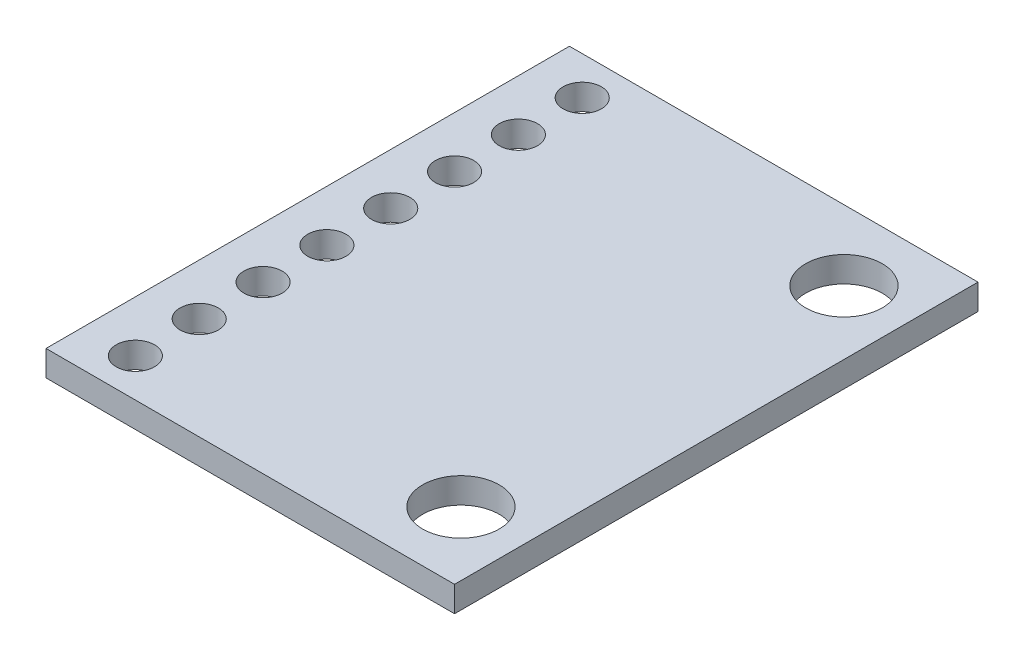
ISO-10303-21;
HEADER;
FILE_DESCRIPTION(('STEP AP214'),'2;1');
FILE_NAME('part.step','',(''),(''),'','','');
FILE_SCHEMA(('AUTOMOTIVE_DESIGN { 1 0 10303 214 1 1 1 1 }'));
ENDSEC;
DATA;
#1=APPLICATION_CONTEXT('core data for automotive mechanical design processes');
#2=APPLICATION_PROTOCOL_DEFINITION('international standard','automotive_design',2000,#1);
#3=PRODUCT_CONTEXT('',#1,'mechanical');
#4=PRODUCT('Part','Part','',(#3));
#5=PRODUCT_RELATED_PRODUCT_CATEGORY('part','',(#4));
#6=PRODUCT_DEFINITION_FORMATION('','',#4);
#7=PRODUCT_DEFINITION_CONTEXT('part definition',#1,'design');
#8=PRODUCT_DEFINITION('design','',#6,#7);
#9=PRODUCT_DEFINITION_SHAPE('','',#8);
#10=(LENGTH_UNIT() NAMED_UNIT(*) SI_UNIT(.MILLI.,.METRE.));
#11=(NAMED_UNIT(*) PLANE_ANGLE_UNIT() SI_UNIT($,.RADIAN.));
#12=(NAMED_UNIT(*) SI_UNIT($,.STERADIAN.) SOLID_ANGLE_UNIT());
#13=UNCERTAINTY_MEASURE_WITH_UNIT(LENGTH_MEASURE(1.E-05),#10,'distance_accuracy_value','');
#14=(GEOMETRIC_REPRESENTATION_CONTEXT(3) GLOBAL_UNCERTAINTY_ASSIGNED_CONTEXT((#13)) GLOBAL_UNIT_ASSIGNED_CONTEXT((#10,
#11,#12)) REPRESENTATION_CONTEXT('',''));
#15=CARTESIAN_POINT('',(0.,0.,0.));
#16=DIRECTION('',(0.,0.,1.));
#17=DIRECTION('',(1.,0.,0.));
#18=AXIS2_PLACEMENT_3D('',#15,#16,#17);
#19=CARTESIAN_POINT('',(0.,1.,0.));
#20=DIRECTION('',(0.,-1.,0.));
#21=DIRECTION('',(0.,0.,-1.));
#22=AXIS2_PLACEMENT_3D('',#19,#20,#21);
#23=PLANE('',#22);
#24=CARTESIAN_POINT('',(-5.99999999999998,1.,-8.74999999999985));
#25=DIRECTION('',(0.,1.,0.));
#26=DIRECTION('',(0.,0.,1.));
#27=AXIS2_PLACEMENT_3D('',#24,#25,#26);
#28=CIRCLE('',#27,0.75);
#29=CARTESIAN_POINT('',(-5.99999999999998,1.,-7.99999999999985));
#30=VERTEX_POINT('',#29);
#31=EDGE_CURVE('E166',#30,#30,#28,.T.);
#32=ORIENTED_EDGE('',*,*,#31,.F.);
#33=EDGE_LOOP('',(#32));
#34=FACE_BOUND('',#33,.T.);
#35=CARTESIAN_POINT('',(-5.99999999999996,1.,-6.24999999999985));
#36=DIRECTION('',(0.,1.,0.));
#37=DIRECTION('',(0.,0.,1.));
#38=AXIS2_PLACEMENT_3D('',#35,#36,#37);
#39=CIRCLE('',#38,0.75);
#40=CARTESIAN_POINT('',(-5.99999999999996,1.,-5.49999999999985));
#41=VERTEX_POINT('',#40);
#42=EDGE_CURVE('E160',#41,#41,#39,.T.);
#43=ORIENTED_EDGE('',*,*,#42,.F.);
#44=EDGE_LOOP('',(#43));
#45=FACE_BOUND('',#44,.T.);
#46=CARTESIAN_POINT('',(-5.99999999999993,1.,-3.74999999999984));
#47=DIRECTION('',(0.,1.,0.));
#48=DIRECTION('',(0.,0.,1.));
#49=AXIS2_PLACEMENT_3D('',#46,#47,#48);
#50=CIRCLE('',#49,0.75);
#51=CARTESIAN_POINT('',(-5.99999999999993,1.,-2.99999999999984));
#52=VERTEX_POINT('',#51);
#53=EDGE_CURVE('E154',#52,#52,#50,.T.);
#54=ORIENTED_EDGE('',*,*,#53,.F.);
#55=EDGE_LOOP('',(#54));
#56=FACE_BOUND('',#55,.T.);
#57=CARTESIAN_POINT('',(-5.9999999999999,1.,-1.24999999999983));
#58=DIRECTION('',(0.,1.,0.));
#59=DIRECTION('',(0.,0.,1.));
#60=AXIS2_PLACEMENT_3D('',#57,#58,#59);
#61=CIRCLE('',#60,0.750000000000001);
#62=CARTESIAN_POINT('',(-5.9999999999999,1.,-0.499999999999833));
#63=VERTEX_POINT('',#62);
#64=EDGE_CURVE('E148',#63,#63,#61,.T.);
#65=ORIENTED_EDGE('',*,*,#64,.F.);
#66=EDGE_LOOP('',(#65));
#67=FACE_BOUND('',#66,.T.);
#68=CARTESIAN_POINT('',(-5.99999999999988,1.,1.25000000000017));
#69=DIRECTION('',(0.,1.,0.));
#70=DIRECTION('',(0.,0.,1.));
#71=AXIS2_PLACEMENT_3D('',#68,#69,#70);
#72=CIRCLE('',#71,0.750000000000001);
#73=CARTESIAN_POINT('',(-5.99999999999988,1.,2.00000000000017));
#74=VERTEX_POINT('',#73);
#75=EDGE_CURVE('E142',#74,#74,#72,.T.);
#76=ORIENTED_EDGE('',*,*,#75,.F.);
#77=EDGE_LOOP('',(#76));
#78=FACE_BOUND('',#77,.T.);
#79=CARTESIAN_POINT('',(-5.99999999999985,1.,3.75000000000018));
#80=DIRECTION('',(0.,1.,0.));
#81=DIRECTION('',(0.,0.,1.));
#82=AXIS2_PLACEMENT_3D('',#79,#80,#81);
#83=CIRCLE('',#82,0.750000000000001);
#84=CARTESIAN_POINT('',(-5.99999999999985,1.,4.50000000000018));
#85=VERTEX_POINT('',#84);
#86=EDGE_CURVE('E136',#85,#85,#83,.T.);
#87=ORIENTED_EDGE('',*,*,#86,.F.);
#88=EDGE_LOOP('',(#87));
#89=FACE_BOUND('',#88,.T.);
#90=CARTESIAN_POINT('',(-5.99999999999983,1.,6.25000000000018));
#91=DIRECTION('',(0.,1.,0.));
#92=DIRECTION('',(0.,0.,1.));
#93=AXIS2_PLACEMENT_3D('',#90,#91,#92);
#94=CIRCLE('',#93,0.750000000000001);
#95=CARTESIAN_POINT('',(-5.99999999999983,1.,7.00000000000019));
#96=VERTEX_POINT('',#95);
#97=EDGE_CURVE('E130',#96,#96,#94,.T.);
#98=ORIENTED_EDGE('',*,*,#97,.F.);
#99=EDGE_LOOP('',(#98));
#100=FACE_BOUND('',#99,.T.);
#101=CARTESIAN_POINT('',(-5.9999999999998,1.,8.75000000000019));
#102=DIRECTION('',(0.,1.,0.));
#103=DIRECTION('',(0.,0.,1.));
#104=AXIS2_PLACEMENT_3D('',#101,#102,#103);
#105=CIRCLE('',#104,0.750000000000001);
#106=CARTESIAN_POINT('',(-5.9999999999998,1.,9.50000000000019));
#107=VERTEX_POINT('',#106);
#108=EDGE_CURVE('E124',#107,#107,#105,.T.);
#109=ORIENTED_EDGE('',*,*,#108,.F.);
#110=EDGE_LOOP('',(#109));
#111=FACE_BOUND('',#110,.T.);
#112=DIRECTION('',(0.,0.,-1.));
#113=VECTOR('',#112,1.);
#114=CARTESIAN_POINT('',(8.,1.,10.25));
#115=LINE('',#114,#113);
#116=CARTESIAN_POINT('',(8.,1.,10.25));
#117=VERTEX_POINT('',#116);
#118=CARTESIAN_POINT('',(8.,1.,-10.25));
#119=VERTEX_POINT('',#118);
#120=EDGE_CURVE('E85',#117,#119,#115,.T.);
#121=ORIENTED_EDGE('',*,*,#120,.T.);
#122=DIRECTION('',(-1.,0.,0.));
#123=VECTOR('',#122,1.);
#124=CARTESIAN_POINT('',(-8.,1.,-10.25));
#125=LINE('',#124,#123);
#126=CARTESIAN_POINT('',(-8.,1.,-10.25));
#127=VERTEX_POINT('',#126);
#128=EDGE_CURVE('E80',#119,#127,#125,.T.);
#129=ORIENTED_EDGE('',*,*,#128,.T.);
#130=DIRECTION('',(0.,0.,1.));
#131=VECTOR('',#130,1.);
#132=CARTESIAN_POINT('',(-8.,1.,10.25));
#133=LINE('',#132,#131);
#134=CARTESIAN_POINT('',(-8.,1.,10.25));
#135=VERTEX_POINT('',#134);
#136=EDGE_CURVE('E83',#127,#135,#133,.T.);
#137=ORIENTED_EDGE('',*,*,#136,.T.);
#138=DIRECTION('',(1.,0.,0.));
#139=VECTOR('',#138,1.);
#140=CARTESIAN_POINT('',(-8.,1.,10.25));
#141=LINE('',#140,#139);
#142=EDGE_CURVE('E50',#135,#117,#141,.T.);
#143=ORIENTED_EDGE('',*,*,#142,.T.);
#144=EDGE_LOOP('',(#121,#129,#137,#143));
#145=FACE_BOUND('',#144,.T.);
#146=CARTESIAN_POINT('',(5.5,1.,-7.5));
#147=DIRECTION('',(0.,1.,0.));
#148=DIRECTION('',(0.,0.,1.));
#149=AXIS2_PLACEMENT_3D('',#146,#147,#148);
#150=CIRCLE('',#149,1.5);
#151=CARTESIAN_POINT('',(5.5,1.,-6.));
#152=VERTEX_POINT('',#151);
#153=EDGE_CURVE('E100',#152,#152,#150,.T.);
#154=ORIENTED_EDGE('',*,*,#153,.F.);
#155=EDGE_LOOP('',(#154));
#156=FACE_BOUND('',#155,.T.);
#157=CARTESIAN_POINT('',(5.5,1.,7.5));
#158=DIRECTION('',(0.,1.,0.));
#159=DIRECTION('',(0.,0.,1.));
#160=AXIS2_PLACEMENT_3D('',#157,#158,#159);
#161=CIRCLE('',#160,1.5);
#162=CARTESIAN_POINT('',(5.5,1.,9.));
#163=VERTEX_POINT('',#162);
#164=EDGE_CURVE('E115',#163,#163,#161,.T.);
#165=ORIENTED_EDGE('',*,*,#164,.F.);
#166=EDGE_LOOP('',(#165));
#167=FACE_BOUND('',#166,.T.);
#168=ADVANCED_FACE('F33',(#34,#45,#56,#67,#78,#89,#100,#111,#145,#156,#167),#23,.F.);
#169=CARTESIAN_POINT('',(0.,0.,0.));
#170=DIRECTION('',(0.,-1.,0.));
#171=DIRECTION('',(0.,0.,-1.));
#172=AXIS2_PLACEMENT_3D('',#169,#170,#171);
#173=PLANE('',#172);
#174=CARTESIAN_POINT('',(-5.99999999999998,0.,-8.74999999999985));
#175=DIRECTION('',(0.,1.,0.));
#176=DIRECTION('',(0.,0.,1.));
#177=AXIS2_PLACEMENT_3D('',#174,#175,#176);
#178=CIRCLE('',#177,0.75);
#179=CARTESIAN_POINT('',(-5.99999999999998,0.,-7.99999999999985));
#180=VERTEX_POINT('',#179);
#181=EDGE_CURVE('E121',#180,#180,#178,.T.);
#182=ORIENTED_EDGE('',*,*,#181,.T.);
#183=EDGE_LOOP('',(#182));
#184=FACE_BOUND('',#183,.T.);
#185=CARTESIAN_POINT('',(-5.99999999999996,0.,-6.24999999999985));
#186=DIRECTION('',(0.,1.,0.));
#187=DIRECTION('',(0.,0.,1.));
#188=AXIS2_PLACEMENT_3D('',#185,#186,#187);
#189=CIRCLE('',#188,0.75);
#190=CARTESIAN_POINT('',(-5.99999999999996,0.,-5.49999999999985));
#191=VERTEX_POINT('',#190);
#192=EDGE_CURVE('E163',#191,#191,#189,.T.);
#193=ORIENTED_EDGE('',*,*,#192,.T.);
#194=EDGE_LOOP('',(#193));
#195=FACE_BOUND('',#194,.T.);
#196=CARTESIAN_POINT('',(-5.99999999999993,0.,-3.74999999999984));
#197=DIRECTION('',(0.,1.,0.));
#198=DIRECTION('',(0.,0.,1.));
#199=AXIS2_PLACEMENT_3D('',#196,#197,#198);
#200=CIRCLE('',#199,0.75);
#201=CARTESIAN_POINT('',(-5.99999999999993,0.,-2.99999999999984));
#202=VERTEX_POINT('',#201);
#203=EDGE_CURVE('E157',#202,#202,#200,.T.);
#204=ORIENTED_EDGE('',*,*,#203,.T.);
#205=EDGE_LOOP('',(#204));
#206=FACE_BOUND('',#205,.T.);
#207=CARTESIAN_POINT('',(-5.9999999999999,0.,-1.24999999999983));
#208=DIRECTION('',(0.,1.,0.));
#209=DIRECTION('',(0.,0.,1.));
#210=AXIS2_PLACEMENT_3D('',#207,#208,#209);
#211=CIRCLE('',#210,0.750000000000001);
#212=CARTESIAN_POINT('',(-5.9999999999999,0.,-0.499999999999833));
#213=VERTEX_POINT('',#212);
#214=EDGE_CURVE('E151',#213,#213,#211,.T.);
#215=ORIENTED_EDGE('',*,*,#214,.T.);
#216=EDGE_LOOP('',(#215));
#217=FACE_BOUND('',#216,.T.);
#218=CARTESIAN_POINT('',(-5.99999999999988,0.,1.25000000000017));
#219=DIRECTION('',(0.,1.,0.));
#220=DIRECTION('',(0.,0.,1.));
#221=AXIS2_PLACEMENT_3D('',#218,#219,#220);
#222=CIRCLE('',#221,0.750000000000001);
#223=CARTESIAN_POINT('',(-5.99999999999988,0.,2.00000000000017));
#224=VERTEX_POINT('',#223);
#225=EDGE_CURVE('E145',#224,#224,#222,.T.);
#226=ORIENTED_EDGE('',*,*,#225,.T.);
#227=EDGE_LOOP('',(#226));
#228=FACE_BOUND('',#227,.T.);
#229=CARTESIAN_POINT('',(-5.99999999999985,0.,3.75000000000018));
#230=DIRECTION('',(0.,1.,0.));
#231=DIRECTION('',(0.,0.,1.));
#232=AXIS2_PLACEMENT_3D('',#229,#230,#231);
#233=CIRCLE('',#232,0.750000000000001);
#234=CARTESIAN_POINT('',(-5.99999999999985,0.,4.50000000000018));
#235=VERTEX_POINT('',#234);
#236=EDGE_CURVE('E139',#235,#235,#233,.T.);
#237=ORIENTED_EDGE('',*,*,#236,.T.);
#238=EDGE_LOOP('',(#237));
#239=FACE_BOUND('',#238,.T.);
#240=CARTESIAN_POINT('',(-5.99999999999983,0.,6.25000000000018));
#241=DIRECTION('',(0.,1.,0.));
#242=DIRECTION('',(0.,0.,1.));
#243=AXIS2_PLACEMENT_3D('',#240,#241,#242);
#244=CIRCLE('',#243,0.750000000000001);
#245=CARTESIAN_POINT('',(-5.99999999999983,0.,7.00000000000019));
#246=VERTEX_POINT('',#245);
#247=EDGE_CURVE('E133',#246,#246,#244,.T.);
#248=ORIENTED_EDGE('',*,*,#247,.T.);
#249=EDGE_LOOP('',(#248));
#250=FACE_BOUND('',#249,.T.);
#251=CARTESIAN_POINT('',(-5.9999999999998,0.,8.75000000000019));
#252=DIRECTION('',(0.,1.,0.));
#253=DIRECTION('',(0.,0.,1.));
#254=AXIS2_PLACEMENT_3D('',#251,#252,#253);
#255=CIRCLE('',#254,0.750000000000001);
#256=CARTESIAN_POINT('',(-5.9999999999998,0.,9.50000000000019));
#257=VERTEX_POINT('',#256);
#258=EDGE_CURVE('E127',#257,#257,#255,.T.);
#259=ORIENTED_EDGE('',*,*,#258,.T.);
#260=EDGE_LOOP('',(#259));
#261=FACE_BOUND('',#260,.T.);
#262=CARTESIAN_POINT('',(5.5,0.,-7.5));
#263=DIRECTION('',(0.,1.,0.));
#264=DIRECTION('',(0.,0.,1.));
#265=AXIS2_PLACEMENT_3D('',#262,#263,#264);
#266=CIRCLE('',#265,1.5);
#267=CARTESIAN_POINT('',(5.5,0.,-6.));
#268=VERTEX_POINT('',#267);
#269=EDGE_CURVE('E112',#268,#268,#266,.T.);
#270=ORIENTED_EDGE('',*,*,#269,.T.);
#271=EDGE_LOOP('',(#270));
#272=FACE_BOUND('',#271,.T.);
#273=DIRECTION('',(0.,0.,-1.));
#274=VECTOR('',#273,1.);
#275=CARTESIAN_POINT('',(8.,0.,10.25));
#276=LINE('',#275,#274);
#277=CARTESIAN_POINT('',(8.,0.,10.25));
#278=VERTEX_POINT('',#277);
#279=CARTESIAN_POINT('',(8.,0.,-10.25));
#280=VERTEX_POINT('',#279);
#281=EDGE_CURVE('E97',#278,#280,#276,.T.);
#282=ORIENTED_EDGE('',*,*,#281,.F.);
#283=DIRECTION('',(1.,0.,0.));
#284=VECTOR('',#283,1.);
#285=CARTESIAN_POINT('',(-8.,0.,10.25));
#286=LINE('',#285,#284);
#287=CARTESIAN_POINT('',(-8.,0.,10.25));
#288=VERTEX_POINT('',#287);
#289=EDGE_CURVE('E73',#288,#278,#286,.T.);
#290=ORIENTED_EDGE('',*,*,#289,.F.);
#291=DIRECTION('',(0.,0.,1.));
#292=VECTOR('',#291,1.);
#293=CARTESIAN_POINT('',(-8.,0.,10.25));
#294=LINE('',#293,#292);
#295=CARTESIAN_POINT('',(-8.,0.,-10.25));
#296=VERTEX_POINT('',#295);
#297=EDGE_CURVE('E67',#296,#288,#294,.T.);
#298=ORIENTED_EDGE('',*,*,#297,.F.);
#299=DIRECTION('',(-1.,0.,0.));
#300=VECTOR('',#299,1.);
#301=CARTESIAN_POINT('',(-8.,0.,-10.25));
#302=LINE('',#301,#300);
#303=EDGE_CURVE('E89',#280,#296,#302,.T.);
#304=ORIENTED_EDGE('',*,*,#303,.F.);
#305=EDGE_LOOP('',(#282,#290,#298,#304));
#306=FACE_BOUND('',#305,.T.);
#307=CARTESIAN_POINT('',(5.5,0.,7.5));
#308=DIRECTION('',(0.,1.,0.));
#309=DIRECTION('',(0.,0.,1.));
#310=AXIS2_PLACEMENT_3D('',#307,#308,#309);
#311=CIRCLE('',#310,1.5);
#312=CARTESIAN_POINT('',(5.5,0.,9.));
#313=VERTEX_POINT('',#312);
#314=EDGE_CURVE('E118',#313,#313,#311,.T.);
#315=ORIENTED_EDGE('',*,*,#314,.T.);
#316=EDGE_LOOP('',(#315));
#317=FACE_BOUND('',#316,.T.);
#318=ADVANCED_FACE('F108',(#184,#195,#206,#217,#228,#239,#250,#261,#272,#306,#317),#173,.T.);
#319=CARTESIAN_POINT('',(8.,1.,10.25));
#320=DIRECTION('',(-1.,0.,0.));
#321=DIRECTION('',(0.,0.,1.));
#322=AXIS2_PLACEMENT_3D('',#319,#320,#321);
#323=PLANE('',#322);
#324=ORIENTED_EDGE('',*,*,#281,.T.);
#325=DIRECTION('',(0.,-1.,0.));
#326=VECTOR('',#325,1.);
#327=CARTESIAN_POINT('',(8.,1.,-10.25));
#328=LINE('',#327,#326);
#329=EDGE_CURVE('E11',#119,#280,#328,.T.);
#330=ORIENTED_EDGE('',*,*,#329,.F.);
#331=ORIENTED_EDGE('',*,*,#120,.F.);
#332=DIRECTION('',(0.,-1.,0.));
#333=VECTOR('',#332,1.);
#334=CARTESIAN_POINT('',(8.,1.,10.25));
#335=LINE('',#334,#333);
#336=EDGE_CURVE('E93',#117,#278,#335,.T.);
#337=ORIENTED_EDGE('',*,*,#336,.T.);
#338=EDGE_LOOP('',(#324,#330,#331,#337));
#339=FACE_BOUND('',#338,.T.);
#340=ADVANCED_FACE('F35',(#339),#323,.F.);
#341=CARTESIAN_POINT('',(-8.,1.,-10.25));
#342=DIRECTION('',(0.,0.,1.));
#343=DIRECTION('',(1.,0.,0.));
#344=AXIS2_PLACEMENT_3D('',#341,#342,#343);
#345=PLANE('',#344);
#346=ORIENTED_EDGE('',*,*,#303,.T.);
#347=DIRECTION('',(0.,-1.,0.));
#348=VECTOR('',#347,1.);
#349=CARTESIAN_POINT('',(-8.,1.,-10.25));
#350=LINE('',#349,#348);
#351=EDGE_CURVE('E42',#127,#296,#350,.T.);
#352=ORIENTED_EDGE('',*,*,#351,.F.);
#353=ORIENTED_EDGE('',*,*,#128,.F.);
#354=ORIENTED_EDGE('',*,*,#329,.T.);
#355=EDGE_LOOP('',(#346,#352,#353,#354));
#356=FACE_BOUND('',#355,.T.);
#357=ADVANCED_FACE('F88',(#356),#345,.F.);
#358=CARTESIAN_POINT('',(-8.,1.,10.25));
#359=DIRECTION('',(1.,0.,0.));
#360=DIRECTION('',(0.,0.,-1.));
#361=AXIS2_PLACEMENT_3D('',#358,#359,#360);
#362=PLANE('',#361);
#363=ORIENTED_EDGE('',*,*,#297,.T.);
#364=DIRECTION('',(0.,-1.,0.));
#365=VECTOR('',#364,1.);
#366=CARTESIAN_POINT('',(-8.,1.,10.25));
#367=LINE('',#366,#365);
#368=EDGE_CURVE('E90',#135,#288,#367,.T.);
#369=ORIENTED_EDGE('',*,*,#368,.F.);
#370=ORIENTED_EDGE('',*,*,#136,.F.);
#371=ORIENTED_EDGE('',*,*,#351,.T.);
#372=EDGE_LOOP('',(#363,#369,#370,#371));
#373=FACE_BOUND('',#372,.T.);
#374=ADVANCED_FACE('F91',(#373),#362,.F.);
#375=CARTESIAN_POINT('',(-8.,1.,10.25));
#376=DIRECTION('',(0.,0.,-1.));
#377=DIRECTION('',(-1.,0.,0.));
#378=AXIS2_PLACEMENT_3D('',#375,#376,#377);
#379=PLANE('',#378);
#380=ORIENTED_EDGE('',*,*,#289,.T.);
#381=ORIENTED_EDGE('',*,*,#336,.F.);
#382=ORIENTED_EDGE('',*,*,#142,.F.);
#383=ORIENTED_EDGE('',*,*,#368,.T.);
#384=EDGE_LOOP('',(#380,#381,#382,#383));
#385=FACE_BOUND('',#384,.T.);
#386=ADVANCED_FACE('F105',(#385),#379,.F.);
#387=CARTESIAN_POINT('',(5.5,1.,-7.5));
#388=DIRECTION('',(0.,-1.,0.));
#389=DIRECTION('',(0.,0.,-1.));
#390=AXIS2_PLACEMENT_3D('',#387,#388,#389);
#391=CYLINDRICAL_SURFACE('',#390,1.5);
#392=ORIENTED_EDGE('',*,*,#153,.T.);
#393=EDGE_LOOP('',(#392));
#394=FACE_BOUND('',#393,.T.);
#395=ORIENTED_EDGE('',*,*,#269,.F.);
#396=EDGE_LOOP('',(#395));
#397=FACE_BOUND('',#396,.T.);
#398=ADVANCED_FACE('F211',(#394,#397),#391,.F.);
#399=CARTESIAN_POINT('',(5.5,1.,7.5));
#400=DIRECTION('',(0.,-1.,0.));
#401=DIRECTION('',(0.,0.,-1.));
#402=AXIS2_PLACEMENT_3D('',#399,#400,#401);
#403=CYLINDRICAL_SURFACE('',#402,1.5);
#404=ORIENTED_EDGE('',*,*,#164,.T.);
#405=EDGE_LOOP('',(#404));
#406=FACE_BOUND('',#405,.T.);
#407=ORIENTED_EDGE('',*,*,#314,.F.);
#408=EDGE_LOOP('',(#407));
#409=FACE_BOUND('',#408,.T.);
#410=ADVANCED_FACE('F201',(#406,#409),#403,.F.);
#411=CARTESIAN_POINT('',(-5.9999999999998,0.,8.75000000000019));
#412=DIRECTION('',(0.,1.,0.));
#413=DIRECTION('',(0.,0.,1.));
#414=AXIS2_PLACEMENT_3D('',#411,#412,#413);
#415=CYLINDRICAL_SURFACE('',#414,0.750000000000001);
#416=ORIENTED_EDGE('',*,*,#258,.F.);
#417=EDGE_LOOP('',(#416));
#418=FACE_BOUND('',#417,.T.);
#419=ORIENTED_EDGE('',*,*,#108,.T.);
#420=EDGE_LOOP('',(#419));
#421=FACE_BOUND('',#420,.T.);
#422=ADVANCED_FACE('F198',(#418,#421),#415,.F.);
#423=CARTESIAN_POINT('',(-5.99999999999983,0.,6.25000000000018));
#424=DIRECTION('',(0.,1.,0.));
#425=DIRECTION('',(0.,0.,1.));
#426=AXIS2_PLACEMENT_3D('',#423,#424,#425);
#427=CYLINDRICAL_SURFACE('',#426,0.750000000000001);
#428=ORIENTED_EDGE('',*,*,#247,.F.);
#429=EDGE_LOOP('',(#428));
#430=FACE_BOUND('',#429,.T.);
#431=ORIENTED_EDGE('',*,*,#97,.T.);
#432=EDGE_LOOP('',(#431));
#433=FACE_BOUND('',#432,.T.);
#434=ADVANCED_FACE('F200',(#430,#433),#427,.F.);
#435=CARTESIAN_POINT('',(-5.99999999999985,0.,3.75000000000018));
#436=DIRECTION('',(0.,1.,0.));
#437=DIRECTION('',(0.,0.,1.));
#438=AXIS2_PLACEMENT_3D('',#435,#436,#437);
#439=CYLINDRICAL_SURFACE('',#438,0.750000000000001);
#440=ORIENTED_EDGE('',*,*,#236,.F.);
#441=EDGE_LOOP('',(#440));
#442=FACE_BOUND('',#441,.T.);
#443=ORIENTED_EDGE('',*,*,#86,.T.);
#444=EDGE_LOOP('',(#443));
#445=FACE_BOUND('',#444,.T.);
#446=ADVANCED_FACE('F208',(#442,#445),#439,.F.);
#447=CARTESIAN_POINT('',(-5.99999999999988,0.,1.25000000000017));
#448=DIRECTION('',(0.,1.,0.));
#449=DIRECTION('',(0.,0.,1.));
#450=AXIS2_PLACEMENT_3D('',#447,#448,#449);
#451=CYLINDRICAL_SURFACE('',#450,0.750000000000001);
#452=ORIENTED_EDGE('',*,*,#225,.F.);
#453=EDGE_LOOP('',(#452));
#454=FACE_BOUND('',#453,.T.);
#455=ORIENTED_EDGE('',*,*,#75,.T.);
#456=EDGE_LOOP('',(#455));
#457=FACE_BOUND('',#456,.T.);
#458=ADVANCED_FACE('F290',(#454,#457),#451,.F.);
#459=CARTESIAN_POINT('',(-5.9999999999999,0.,-1.24999999999983));
#460=DIRECTION('',(0.,1.,0.));
#461=DIRECTION('',(0.,0.,1.));
#462=AXIS2_PLACEMENT_3D('',#459,#460,#461);
#463=CYLINDRICAL_SURFACE('',#462,0.750000000000001);
#464=ORIENTED_EDGE('',*,*,#214,.F.);
#465=EDGE_LOOP('',(#464));
#466=FACE_BOUND('',#465,.T.);
#467=ORIENTED_EDGE('',*,*,#64,.T.);
#468=EDGE_LOOP('',(#467));
#469=FACE_BOUND('',#468,.T.);
#470=ADVANCED_FACE('F298',(#466,#469),#463,.F.);
#471=CARTESIAN_POINT('',(-5.99999999999993,0.,-3.74999999999984));
#472=DIRECTION('',(0.,1.,0.));
#473=DIRECTION('',(0.,0.,1.));
#474=AXIS2_PLACEMENT_3D('',#471,#472,#473);
#475=CYLINDRICAL_SURFACE('',#474,0.75);
#476=ORIENTED_EDGE('',*,*,#203,.F.);
#477=EDGE_LOOP('',(#476));
#478=FACE_BOUND('',#477,.T.);
#479=ORIENTED_EDGE('',*,*,#53,.T.);
#480=EDGE_LOOP('',(#479));
#481=FACE_BOUND('',#480,.T.);
#482=ADVANCED_FACE('F307',(#478,#481),#475,.F.);
#483=CARTESIAN_POINT('',(-5.99999999999996,0.,-6.24999999999985));
#484=DIRECTION('',(0.,1.,0.));
#485=DIRECTION('',(0.,0.,1.));
#486=AXIS2_PLACEMENT_3D('',#483,#484,#485);
#487=CYLINDRICAL_SURFACE('',#486,0.75);
#488=ORIENTED_EDGE('',*,*,#192,.F.);
#489=EDGE_LOOP('',(#488));
#490=FACE_BOUND('',#489,.T.);
#491=ORIENTED_EDGE('',*,*,#42,.T.);
#492=EDGE_LOOP('',(#491));
#493=FACE_BOUND('',#492,.T.);
#494=ADVANCED_FACE('F177',(#490,#493),#487,.F.);
#495=CARTESIAN_POINT('',(-5.99999999999998,0.,-8.74999999999985));
#496=DIRECTION('',(0.,1.,0.));
#497=DIRECTION('',(0.,0.,1.));
#498=AXIS2_PLACEMENT_3D('',#495,#496,#497);
#499=CYLINDRICAL_SURFACE('',#498,0.75);
#500=ORIENTED_EDGE('',*,*,#181,.F.);
#501=EDGE_LOOP('',(#500));
#502=FACE_BOUND('',#501,.T.);
#503=ORIENTED_EDGE('',*,*,#31,.T.);
#504=EDGE_LOOP('',(#503));
#505=FACE_BOUND('',#504,.T.);
#506=ADVANCED_FACE('F174',(#502,#505),#499,.F.);
#507=CLOSED_SHELL('',(#168,#318,#340,#357,#374,#386,#398,#410,#422,#434,#446,#458,#470,#482,
#494,#506));
#508=MANIFOLD_SOLID_BREP('B2',#507);
#509=ADVANCED_BREP_SHAPE_REPRESENTATION('',(#18,#508),#14);
#510=SHAPE_DEFINITION_REPRESENTATION(#9,#509);
ENDSEC;
END-ISO-10303-21;
